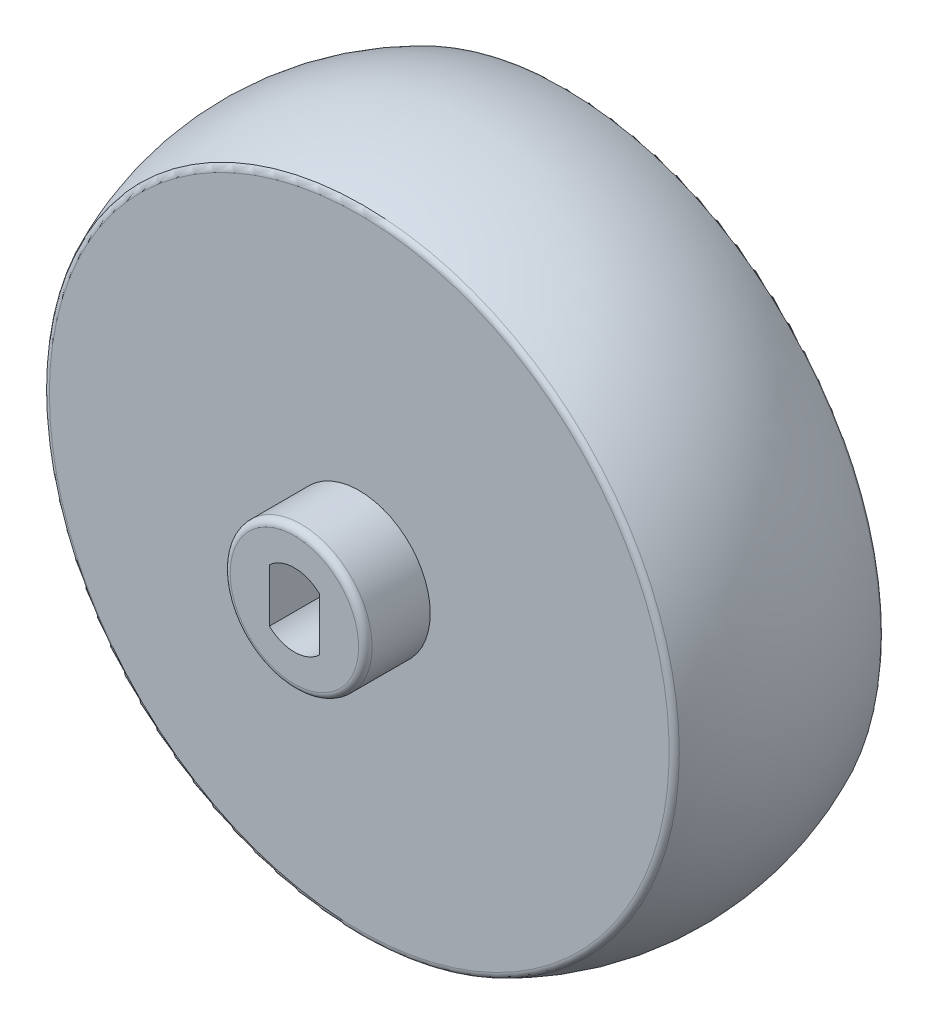
ISO-10303-21;
HEADER;
FILE_DESCRIPTION(('STEP AP214'),'2;1');
FILE_NAME('part.step','',(''),(''),'','','');
FILE_SCHEMA(('AUTOMOTIVE_DESIGN { 1 0 10303 214 1 1 1 1 }'));
ENDSEC;
DATA;
#1=APPLICATION_CONTEXT('core data for automotive mechanical design processes');
#2=APPLICATION_PROTOCOL_DEFINITION('international standard','automotive_design',2000,#1);
#3=PRODUCT_CONTEXT('',#1,'mechanical');
#4=PRODUCT('Part','Part','',(#3));
#5=PRODUCT_RELATED_PRODUCT_CATEGORY('part','',(#4));
#6=PRODUCT_DEFINITION_FORMATION('','',#4);
#7=PRODUCT_DEFINITION_CONTEXT('part definition',#1,'design');
#8=PRODUCT_DEFINITION('design','',#6,#7);
#9=PRODUCT_DEFINITION_SHAPE('','',#8);
#10=(LENGTH_UNIT() NAMED_UNIT(*) SI_UNIT(.MILLI.,.METRE.));
#11=(NAMED_UNIT(*) PLANE_ANGLE_UNIT() SI_UNIT($,.RADIAN.));
#12=(NAMED_UNIT(*) SI_UNIT($,.STERADIAN.) SOLID_ANGLE_UNIT());
#13=UNCERTAINTY_MEASURE_WITH_UNIT(LENGTH_MEASURE(1.E-05),#10,'distance_accuracy_value','');
#14=(GEOMETRIC_REPRESENTATION_CONTEXT(3) GLOBAL_UNCERTAINTY_ASSIGNED_CONTEXT((#13)) GLOBAL_UNIT_ASSIGNED_CONTEXT((#10,
#11,#12)) REPRESENTATION_CONTEXT('',''));
#15=CARTESIAN_POINT('',(0.,0.,0.));
#16=DIRECTION('',(0.,0.,1.));
#17=DIRECTION('',(1.,0.,0.));
#18=AXIS2_PLACEMENT_3D('',#15,#16,#17);
#19=CARTESIAN_POINT('',(0.,5.25,-12.55));
#20=DIRECTION('',(0.,0.,1.));
#21=DIRECTION('',(1.,0.,0.));
#22=AXIS2_PLACEMENT_3D('',#19,#20,#21);
#23=PLANE('',#22);
#24=CARTESIAN_POINT('',(0.,0.,-12.55));
#25=DIRECTION('',(0.,0.,1.));
#26=DIRECTION('',(1.,0.,0.));
#27=AXIS2_PLACEMENT_3D('',#24,#25,#26);
#28=CIRCLE('',#27,4.75);
#29=CARTESIAN_POINT('',(4.75,0.,-12.55));
#30=VERTEX_POINT('',#29);
#31=EDGE_CURVE('E11',#30,#30,#28,.F.);
#32=ORIENTED_EDGE('',*,*,#31,.T.);
#33=EDGE_LOOP('',(#32));
#34=FACE_BOUND('',#33,.T.);
#35=CARTESIAN_POINT('',(0.,0.,-12.55));
#36=DIRECTION('',(0.,0.,1.));
#37=DIRECTION('',(1.,0.,0.));
#38=AXIS2_PLACEMENT_3D('',#35,#36,#37);
#39=CIRCLE('',#38,2.75);
#40=CARTESIAN_POINT('',(2.75,0.,-12.55));
#41=VERTEX_POINT('',#40);
#42=EDGE_CURVE('E120',#41,#41,#39,.T.);
#43=ORIENTED_EDGE('',*,*,#42,.T.);
#44=EDGE_LOOP('',(#43));
#45=FACE_BOUND('',#44,.T.);
#46=ADVANCED_FACE('F34',(#34,#45),#23,.F.);
#47=CARTESIAN_POINT('',(0.,0.,18.63682254611));
#48=DIRECTION('',(0.,0.,1.));
#49=DIRECTION('',(1.,0.,0.));
#50=AXIS2_PLACEMENT_3D('',#47,#48,#49);
#51=CYLINDRICAL_SURFACE('',#50,5.25);
#52=CARTESIAN_POINT('',(0.,0.,-12.05));
#53=DIRECTION('',(0.,0.,1.));
#54=DIRECTION('',(1.,0.,0.));
#55=AXIS2_PLACEMENT_3D('',#52,#53,#54);
#56=CIRCLE('',#55,5.25);
#57=CARTESIAN_POINT('',(5.25,0.,-12.05));
#58=VERTEX_POINT('',#57);
#59=EDGE_CURVE('E42',#58,#58,#56,.T.);
#60=ORIENTED_EDGE('',*,*,#59,.T.);
#61=EDGE_LOOP('',(#60));
#62=FACE_BOUND('',#61,.T.);
#63=CARTESIAN_POINT('',(0.,0.,-7.75));
#64=DIRECTION('',(0.,0.,1.));
#65=DIRECTION('',(1.,0.,0.));
#66=AXIS2_PLACEMENT_3D('',#63,#64,#65);
#67=CIRCLE('',#66,5.25);
#68=CARTESIAN_POINT('',(5.25,0.,-7.75));
#69=VERTEX_POINT('',#68);
#70=EDGE_CURVE('E126',#69,#69,#67,.T.);
#71=ORIENTED_EDGE('',*,*,#70,.F.);
#72=EDGE_LOOP('',(#71));
#73=FACE_BOUND('',#72,.T.);
#74=ADVANCED_FACE('F149',(#62,#73),#51,.T.);
#75=CARTESIAN_POINT('',(0.,23.25,-7.75));
#76=DIRECTION('',(0.,0.,1.));
#77=DIRECTION('',(1.,0.,0.));
#78=AXIS2_PLACEMENT_3D('',#75,#76,#77);
#79=PLANE('',#78);
#80=CARTESIAN_POINT('',(0.,0.,-7.75));
#81=DIRECTION('',(0.,0.,1.));
#82=DIRECTION('',(1.,0.,0.));
#83=AXIS2_PLACEMENT_3D('',#80,#81,#82);
#84=CIRCLE('',#83,22.9310880087404);
#85=CARTESIAN_POINT('',(22.9310880087404,0.,-7.75));
#86=VERTEX_POINT('',#85);
#87=EDGE_CURVE('E138',#86,#86,#84,.F.);
#88=ORIENTED_EDGE('',*,*,#87,.T.);
#89=EDGE_LOOP('',(#88));
#90=FACE_BOUND('',#89,.T.);
#91=ORIENTED_EDGE('',*,*,#70,.T.);
#92=EDGE_LOOP('',(#91));
#93=FACE_BOUND('',#92,.T.);
#94=ADVANCED_FACE('F167',(#90,#93),#79,.F.);
#95=CARTESIAN_POINT('',(0.,0.,0.));
#96=DIRECTION('',(0.,0.,1.));
#97=DIRECTION('',(1.,0.,0.));
#98=AXIS2_PLACEMENT_3D('',#95,#96,#97);
#99=DEGENERATE_TOROIDAL_SURFACE('',#98,6.96428571428569,18.0357142857143,.T.);
#100=CARTESIAN_POINT('',(0.,0.,7.45672097759674));
#101=DIRECTION('',(0.,0.,-1.));
#102=DIRECTION('',(-1.,0.,0.));
#103=AXIS2_PLACEMENT_3D('',#100,#101,#102);
#104=CIRCLE('',#103,23.3863532472788);
#105=CARTESIAN_POINT('',(-23.3863532472788,0.,7.45672097759674));
#106=VERTEX_POINT('',#105);
#107=EDGE_CURVE('E135',#106,#106,#104,.T.);
#108=ORIENTED_EDGE('',*,*,#107,.T.);
#109=EDGE_LOOP('',(#108));
#110=FACE_BOUND('',#109,.T.);
#111=CARTESIAN_POINT('',(0.,0.,-7.45672097759674));
#112=DIRECTION('',(0.,0.,1.));
#113=DIRECTION('',(1.,0.,0.));
#114=AXIS2_PLACEMENT_3D('',#111,#112,#113);
#115=CIRCLE('',#114,23.3863532472788);
#116=CARTESIAN_POINT('',(23.3863532472788,0.,-7.45672097759674));
#117=VERTEX_POINT('',#116);
#118=EDGE_CURVE('E132',#117,#117,#115,.T.);
#119=ORIENTED_EDGE('',*,*,#118,.T.);
#120=EDGE_LOOP('',(#119));
#121=FACE_BOUND('',#120,.T.);
#122=ADVANCED_FACE('F185',(#110,#121),#99,.T.);
#123=CARTESIAN_POINT('',(0.,5.25,7.75));
#124=DIRECTION('',(0.,0.,-1.));
#125=DIRECTION('',(-1.,0.,0.));
#126=AXIS2_PLACEMENT_3D('',#123,#124,#125);
#127=PLANE('',#126);
#128=CARTESIAN_POINT('',(0.,0.,7.75));
#129=DIRECTION('',(0.,0.,-1.));
#130=DIRECTION('',(-1.,0.,0.));
#131=AXIS2_PLACEMENT_3D('',#128,#129,#130);
#132=CIRCLE('',#131,22.9310880087404);
#133=CARTESIAN_POINT('',(-22.9310880087404,0.,7.75));
#134=VERTEX_POINT('',#133);
#135=EDGE_CURVE('E129',#134,#134,#132,.F.);
#136=ORIENTED_EDGE('',*,*,#135,.T.);
#137=EDGE_LOOP('',(#136));
#138=FACE_BOUND('',#137,.T.);
#139=CARTESIAN_POINT('',(0.,0.,7.75));
#140=DIRECTION('',(0.,0.,1.));
#141=DIRECTION('',(1.,0.,0.));
#142=AXIS2_PLACEMENT_3D('',#139,#140,#141);
#143=CIRCLE('',#142,5.25);
#144=CARTESIAN_POINT('',(5.25,0.,7.75));
#145=VERTEX_POINT('',#144);
#146=EDGE_CURVE('E123',#145,#145,#143,.T.);
#147=ORIENTED_EDGE('',*,*,#146,.F.);
#148=EDGE_LOOP('',(#147));
#149=FACE_BOUND('',#148,.T.);
#150=ADVANCED_FACE('F187',(#138,#149),#127,.F.);
#151=CARTESIAN_POINT('',(0.,0.,18.63682254611));
#152=DIRECTION('',(0.,0.,1.));
#153=DIRECTION('',(1.,0.,0.));
#154=AXIS2_PLACEMENT_3D('',#151,#152,#153);
#155=CYLINDRICAL_SURFACE('',#154,5.25);
#156=CARTESIAN_POINT('',(0.,0.,12.05));
#157=DIRECTION('',(0.,0.,-1.));
#158=DIRECTION('',(-1.,0.,0.));
#159=AXIS2_PLACEMENT_3D('',#156,#157,#158);
#160=CIRCLE('',#159,5.25);
#161=CARTESIAN_POINT('',(-5.25,0.,12.05));
#162=VERTEX_POINT('',#161);
#163=EDGE_CURVE('E144',#162,#162,#160,.T.);
#164=ORIENTED_EDGE('',*,*,#163,.T.);
#165=EDGE_LOOP('',(#164));
#166=FACE_BOUND('',#165,.T.);
#167=ORIENTED_EDGE('',*,*,#146,.T.);
#168=EDGE_LOOP('',(#167));
#169=FACE_BOUND('',#168,.T.);
#170=ADVANCED_FACE('F194',(#166,#169),#155,.T.);
#171=CARTESIAN_POINT('',(0.,0.,12.55));
#172=DIRECTION('',(0.,0.,-1.));
#173=DIRECTION('',(-1.,0.,0.));
#174=AXIS2_PLACEMENT_3D('',#171,#172,#173);
#175=PLANE('',#174);
#176=CARTESIAN_POINT('',(0.,0.,12.55));
#177=DIRECTION('',(0.,0.,-1.));
#178=DIRECTION('',(-1.,0.,0.));
#179=AXIS2_PLACEMENT_3D('',#176,#177,#178);
#180=CIRCLE('',#179,4.75);
#181=CARTESIAN_POINT('',(-4.75,0.,12.55));
#182=VERTEX_POINT('',#181);
#183=EDGE_CURVE('E141',#182,#182,#180,.F.);
#184=ORIENTED_EDGE('',*,*,#183,.T.);
#185=EDGE_LOOP('',(#184));
#186=FACE_BOUND('',#185,.T.);
#187=CARTESIAN_POINT('',(0.,0.,12.55));
#188=DIRECTION('',(0.,0.,1.));
#189=DIRECTION('',(1.,0.,0.));
#190=AXIS2_PLACEMENT_3D('',#187,#188,#189);
#191=CIRCLE('',#190,2.7);
#192=CARTESIAN_POINT('',(1.85,1.96659604392971,12.55));
#193=VERTEX_POINT('',#192);
#194=CARTESIAN_POINT('',(-1.85,1.96659604392971,12.55));
#195=VERTEX_POINT('',#194);
#196=EDGE_CURVE('E98',#193,#195,#191,.T.);
#197=ORIENTED_EDGE('',*,*,#196,.F.);
#198=DIRECTION('',(0.,1.,0.));
#199=VECTOR('',#198,1.);
#200=CARTESIAN_POINT('',(1.85,1.96659604392971,12.55));
#201=LINE('',#200,#199);
#202=CARTESIAN_POINT('',(1.85,-1.96659604392971,12.55));
#203=VERTEX_POINT('',#202);
#204=EDGE_CURVE('E91',#203,#193,#201,.T.);
#205=ORIENTED_EDGE('',*,*,#204,.F.);
#206=CARTESIAN_POINT('',(0.,0.,12.55));
#207=DIRECTION('',(0.,0.,1.));
#208=DIRECTION('',(-1.,0.,0.));
#209=AXIS2_PLACEMENT_3D('',#206,#207,#208);
#210=CIRCLE('',#209,2.7);
#211=CARTESIAN_POINT('',(-1.85,-1.96659604392971,12.55));
#212=VERTEX_POINT('',#211);
#213=EDGE_CURVE('E102',#212,#203,#210,.T.);
#214=ORIENTED_EDGE('',*,*,#213,.F.);
#215=DIRECTION('',(0.,-1.,0.));
#216=VECTOR('',#215,1.);
#217=CARTESIAN_POINT('',(-1.85,-1.96659604392971,12.55));
#218=LINE('',#217,#216);
#219=EDGE_CURVE('E49',#195,#212,#218,.T.);
#220=ORIENTED_EDGE('',*,*,#219,.F.);
#221=EDGE_LOOP('',(#197,#205,#214,#220));
#222=FACE_BOUND('',#221,.T.);
#223=ADVANCED_FACE('F201',(#186,#222),#175,.F.);
#224=CARTESIAN_POINT('',(0.,0.,16.3933120624943));
#225=DIRECTION('',(0.,0.,1.));
#226=DIRECTION('',(1.,0.,0.));
#227=AXIS2_PLACEMENT_3D('',#224,#225,#226);
#228=CYLINDRICAL_SURFACE('',#227,2.75);
#229=CARTESIAN_POINT('',(0.,0.,-7.75000000000001));
#230=DIRECTION('',(0.,0.,1.));
#231=DIRECTION('',(1.,0.,0.));
#232=AXIS2_PLACEMENT_3D('',#229,#230,#231);
#233=CIRCLE('',#232,2.75);
#234=CARTESIAN_POINT('',(2.75,0.,-7.75000000000001));
#235=VERTEX_POINT('',#234);
#236=EDGE_CURVE('E117',#235,#235,#233,.T.);
#237=ORIENTED_EDGE('',*,*,#236,.T.);
#238=EDGE_LOOP('',(#237));
#239=FACE_BOUND('',#238,.T.);
#240=ORIENTED_EDGE('',*,*,#42,.F.);
#241=EDGE_LOOP('',(#240));
#242=FACE_BOUND('',#241,.T.);
#243=ADVANCED_FACE('F205',(#239,#242),#228,.F.);
#244=CARTESIAN_POINT('',(0.,2.75,-7.75000000000001));
#245=DIRECTION('',(0.,0.,-1.));
#246=DIRECTION('',(-1.,0.,0.));
#247=AXIS2_PLACEMENT_3D('',#244,#245,#246);
#248=PLANE('',#247);
#249=CARTESIAN_POINT('',(0.,0.,-7.75000000000001));
#250=DIRECTION('',(0.,0.,1.));
#251=DIRECTION('',(1.,0.,0.));
#252=AXIS2_PLACEMENT_3D('',#249,#250,#251);
#253=CIRCLE('',#252,1.5);
#254=CARTESIAN_POINT('',(1.5,0.,-7.75000000000001));
#255=VERTEX_POINT('',#254);
#256=EDGE_CURVE('E114',#255,#255,#253,.T.);
#257=ORIENTED_EDGE('',*,*,#256,.T.);
#258=EDGE_LOOP('',(#257));
#259=FACE_BOUND('',#258,.T.);
#260=ORIENTED_EDGE('',*,*,#236,.F.);
#261=EDGE_LOOP('',(#260));
#262=FACE_BOUND('',#261,.T.);
#263=ADVANCED_FACE('F209',(#259,#262),#248,.T.);
#264=CARTESIAN_POINT('',(0.,0.,16.3933120624943));
#265=DIRECTION('',(0.,0.,1.));
#266=DIRECTION('',(1.,0.,0.));
#267=AXIS2_PLACEMENT_3D('',#264,#265,#266);
#268=CYLINDRICAL_SURFACE('',#267,1.5);
#269=CARTESIAN_POINT('',(0.,0.,0.850000000000009));
#270=DIRECTION('',(0.,0.,1.));
#271=DIRECTION('',(1.,0.,0.));
#272=AXIS2_PLACEMENT_3D('',#269,#270,#271);
#273=CIRCLE('',#272,1.5);
#274=CARTESIAN_POINT('',(1.5,0.,0.850000000000009));
#275=VERTEX_POINT('',#274);
#276=EDGE_CURVE('E111',#275,#275,#273,.T.);
#277=ORIENTED_EDGE('',*,*,#276,.T.);
#278=EDGE_LOOP('',(#277));
#279=FACE_BOUND('',#278,.T.);
#280=ORIENTED_EDGE('',*,*,#256,.F.);
#281=EDGE_LOOP('',(#280));
#282=FACE_BOUND('',#281,.T.);
#283=ADVANCED_FACE('F213',(#279,#282),#268,.F.);
#284=CARTESIAN_POINT('',(0.,1.5,0.850000000000009));
#285=DIRECTION('',(0.,0.,-1.));
#286=DIRECTION('',(-1.,0.,0.));
#287=AXIS2_PLACEMENT_3D('',#284,#285,#286);
#288=PLANE('',#287);
#289=CARTESIAN_POINT('',(0.,0.,0.850000000000009));
#290=DIRECTION('',(0.,0.,-1.));
#291=DIRECTION('',(-1.,0.,0.));
#292=AXIS2_PLACEMENT_3D('',#289,#290,#291);
#293=CIRCLE('',#292,2.7);
#294=CARTESIAN_POINT('',(-1.85,-1.96659604392971,0.850000000000009));
#295=VERTEX_POINT('',#294);
#296=CARTESIAN_POINT('',(1.85,-1.96659604392971,0.850000000000009));
#297=VERTEX_POINT('',#296);
#298=EDGE_CURVE('E96',#295,#297,#293,.F.);
#299=ORIENTED_EDGE('',*,*,#298,.T.);
#300=DIRECTION('',(0.,1.,0.));
#301=VECTOR('',#300,1.);
#302=CARTESIAN_POINT('',(1.85,1.96659604392971,0.850000000000009));
#303=LINE('',#302,#301);
#304=CARTESIAN_POINT('',(1.85,1.96659604392971,0.850000000000009));
#305=VERTEX_POINT('',#304);
#306=EDGE_CURVE('E73',#297,#305,#303,.T.);
#307=ORIENTED_EDGE('',*,*,#306,.T.);
#308=CARTESIAN_POINT('',(0.,0.,0.850000000000009));
#309=DIRECTION('',(0.,0.,-1.));
#310=DIRECTION('',(-1.,0.,0.));
#311=AXIS2_PLACEMENT_3D('',#308,#309,#310);
#312=CIRCLE('',#311,2.7);
#313=CARTESIAN_POINT('',(-1.85,1.96659604392971,0.850000000000009));
#314=VERTEX_POINT('',#313);
#315=EDGE_CURVE('E81',#305,#314,#312,.F.);
#316=ORIENTED_EDGE('',*,*,#315,.T.);
#317=DIRECTION('',(0.,-1.,0.));
#318=VECTOR('',#317,1.);
#319=CARTESIAN_POINT('',(-1.85,-1.96659604392971,0.850000000000009));
#320=LINE('',#319,#318);
#321=EDGE_CURVE('E106',#314,#295,#320,.T.);
#322=ORIENTED_EDGE('',*,*,#321,.T.);
#323=EDGE_LOOP('',(#299,#307,#316,#322));
#324=FACE_BOUND('',#323,.T.);
#325=ORIENTED_EDGE('',*,*,#276,.F.);
#326=EDGE_LOOP('',(#325));
#327=FACE_BOUND('',#326,.T.);
#328=ADVANCED_FACE('F94',(#324,#327),#288,.F.);
#329=CARTESIAN_POINT('',(1.85,1.96659604392971,-5.69599113962125));
#330=DIRECTION('',(1.,0.,0.));
#331=DIRECTION('',(0.,0.,-1.));
#332=AXIS2_PLACEMENT_3D('',#329,#330,#331);
#333=PLANE('',#332);
#334=DIRECTION('',(0.,0.,1.));
#335=VECTOR('',#334,1.);
#336=CARTESIAN_POINT('',(1.85,-1.96659604392971,-5.69599113962125));
#337=LINE('',#336,#335);
#338=EDGE_CURVE('E58',#297,#203,#337,.T.);
#339=ORIENTED_EDGE('',*,*,#338,.T.);
#340=ORIENTED_EDGE('',*,*,#204,.T.);
#341=DIRECTION('',(0.,0.,1.));
#342=VECTOR('',#341,1.);
#343=CARTESIAN_POINT('',(1.85,1.96659604392971,-5.69599113962125));
#344=LINE('',#343,#342);
#345=EDGE_CURVE('E84',#305,#193,#344,.T.);
#346=ORIENTED_EDGE('',*,*,#345,.F.);
#347=ORIENTED_EDGE('',*,*,#306,.F.);
#348=EDGE_LOOP('',(#339,#340,#346,#347));
#349=FACE_BOUND('',#348,.T.);
#350=ADVANCED_FACE('F89',(#349),#333,.F.);
#351=CARTESIAN_POINT('',(0.,0.,-5.69599113962125));
#352=DIRECTION('',(0.,0.,1.));
#353=DIRECTION('',(1.,0.,0.));
#354=AXIS2_PLACEMENT_3D('',#351,#352,#353);
#355=CYLINDRICAL_SURFACE('',#354,2.7);
#356=ORIENTED_EDGE('',*,*,#345,.T.);
#357=ORIENTED_EDGE('',*,*,#196,.T.);
#358=DIRECTION('',(0.,0.,1.));
#359=VECTOR('',#358,1.);
#360=CARTESIAN_POINT('',(-1.85,1.96659604392971,-5.69599113962125));
#361=LINE('',#360,#359);
#362=EDGE_CURVE('E85',#314,#195,#361,.T.);
#363=ORIENTED_EDGE('',*,*,#362,.F.);
#364=ORIENTED_EDGE('',*,*,#315,.F.);
#365=EDGE_LOOP('',(#356,#357,#363,#364));
#366=FACE_BOUND('',#365,.T.);
#367=ADVANCED_FACE('F82',(#366),#355,.F.);
#368=CARTESIAN_POINT('',(-1.85,-1.96659604392971,-5.69599113962125));
#369=DIRECTION('',(-1.,0.,0.));
#370=DIRECTION('',(0.,0.,1.));
#371=AXIS2_PLACEMENT_3D('',#368,#369,#370);
#372=PLANE('',#371);
#373=ORIENTED_EDGE('',*,*,#362,.T.);
#374=ORIENTED_EDGE('',*,*,#219,.T.);
#375=DIRECTION('',(0.,0.,1.));
#376=VECTOR('',#375,1.);
#377=CARTESIAN_POINT('',(-1.85,-1.96659604392971,-5.69599113962125));
#378=LINE('',#377,#376);
#379=EDGE_CURVE('E105',#295,#212,#378,.T.);
#380=ORIENTED_EDGE('',*,*,#379,.F.);
#381=ORIENTED_EDGE('',*,*,#321,.F.);
#382=EDGE_LOOP('',(#373,#374,#380,#381));
#383=FACE_BOUND('',#382,.T.);
#384=ADVANCED_FACE('F224',(#383),#372,.F.);
#385=CARTESIAN_POINT('',(0.,0.,-5.69599113962125));
#386=DIRECTION('',(0.,0.,1.));
#387=DIRECTION('',(1.,0.,0.));
#388=AXIS2_PLACEMENT_3D('',#385,#386,#387);
#389=CYLINDRICAL_SURFACE('',#388,2.7);
#390=ORIENTED_EDGE('',*,*,#379,.T.);
#391=ORIENTED_EDGE('',*,*,#213,.T.);
#392=ORIENTED_EDGE('',*,*,#338,.F.);
#393=ORIENTED_EDGE('',*,*,#298,.F.);
#394=EDGE_LOOP('',(#390,#391,#392,#393));
#395=FACE_BOUND('',#394,.T.);
#396=ADVANCED_FACE('F175',(#395),#389,.F.);
#397=CARTESIAN_POINT('',(0.,0.,7.25));
#398=DIRECTION('',(0.,0.,-1.));
#399=DIRECTION('',(-1.,0.,0.));
#400=AXIS2_PLACEMENT_3D('',#397,#398,#399);
#401=TOROIDAL_SURFACE('',#400,22.9310880087404,0.5);
#402=ORIENTED_EDGE('',*,*,#107,.F.);
#403=EDGE_LOOP('',(#402));
#404=FACE_BOUND('',#403,.T.);
#405=ORIENTED_EDGE('',*,*,#135,.F.);
#406=EDGE_LOOP('',(#405));
#407=FACE_BOUND('',#406,.T.);
#408=ADVANCED_FACE('F172',(#404,#407),#401,.T.);
#409=CARTESIAN_POINT('',(0.,0.,-7.25));
#410=DIRECTION('',(0.,0.,1.));
#411=DIRECTION('',(1.,0.,0.));
#412=AXIS2_PLACEMENT_3D('',#409,#410,#411);
#413=TOROIDAL_SURFACE('',#412,22.9310880087404,0.5);
#414=ORIENTED_EDGE('',*,*,#87,.F.);
#415=EDGE_LOOP('',(#414));
#416=FACE_BOUND('',#415,.T.);
#417=ORIENTED_EDGE('',*,*,#118,.F.);
#418=EDGE_LOOP('',(#417));
#419=FACE_BOUND('',#418,.T.);
#420=ADVANCED_FACE('F158',(#416,#419),#413,.T.);
#421=CARTESIAN_POINT('',(0.,0.,12.05));
#422=DIRECTION('',(0.,0.,-1.));
#423=DIRECTION('',(-1.,0.,0.));
#424=AXIS2_PLACEMENT_3D('',#421,#422,#423);
#425=TOROIDAL_SURFACE('',#424,4.75,0.5);
#426=ORIENTED_EDGE('',*,*,#163,.F.);
#427=EDGE_LOOP('',(#426));
#428=FACE_BOUND('',#427,.T.);
#429=ORIENTED_EDGE('',*,*,#183,.F.);
#430=EDGE_LOOP('',(#429));
#431=FACE_BOUND('',#430,.T.);
#432=ADVANCED_FACE('F153',(#428,#431),#425,.T.);
#433=CARTESIAN_POINT('',(0.,0.,-12.05));
#434=DIRECTION('',(0.,0.,1.));
#435=DIRECTION('',(1.,0.,0.));
#436=AXIS2_PLACEMENT_3D('',#433,#434,#435);
#437=TOROIDAL_SURFACE('',#436,4.75,0.5);
#438=ORIENTED_EDGE('',*,*,#31,.F.);
#439=EDGE_LOOP('',(#438));
#440=FACE_BOUND('',#439,.T.);
#441=ORIENTED_EDGE('',*,*,#59,.F.);
#442=EDGE_LOOP('',(#441));
#443=FACE_BOUND('',#442,.T.);
#444=ADVANCED_FACE('F36',(#440,#443),#437,.T.);
#445=CLOSED_SHELL('',(#46,#74,#94,#122,#150,#170,#223,#243,#263,#283,#328,#350,#367,#384,#396,
#408,#420,#432,#444));
#446=MANIFOLD_SOLID_BREP('B2',#445);
#447=ADVANCED_BREP_SHAPE_REPRESENTATION('',(#18,#446),#14);
#448=SHAPE_DEFINITION_REPRESENTATION(#9,#447);
ENDSEC;
END-ISO-10303-21;
